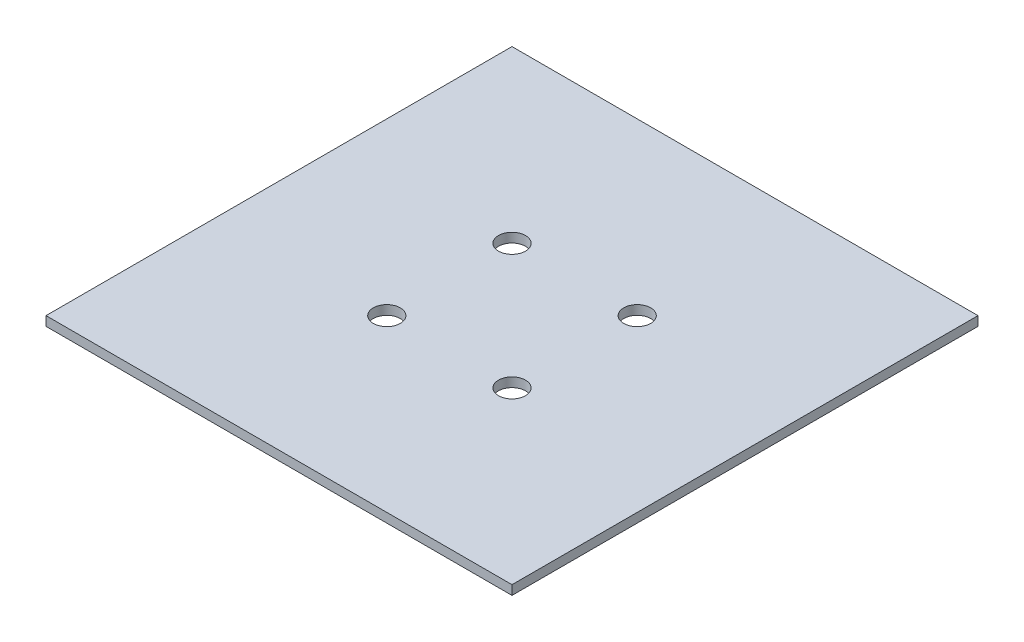
ISO-10303-21;
HEADER;
FILE_DESCRIPTION(('STEP AP214'),'2;1');
FILE_NAME('part.step','',(''),(''),'','','');
FILE_SCHEMA(('AUTOMOTIVE_DESIGN { 1 0 10303 214 1 1 1 1 }'));
ENDSEC;
DATA;
#1=APPLICATION_CONTEXT('core data for automotive mechanical design processes');
#2=APPLICATION_PROTOCOL_DEFINITION('international standard','automotive_design',2000,#1);
#3=PRODUCT_CONTEXT('',#1,'mechanical');
#4=PRODUCT('Part','Part','',(#3));
#5=PRODUCT_RELATED_PRODUCT_CATEGORY('part','',(#4));
#6=PRODUCT_DEFINITION_FORMATION('','',#4);
#7=PRODUCT_DEFINITION_CONTEXT('part definition',#1,'design');
#8=PRODUCT_DEFINITION('design','',#6,#7);
#9=PRODUCT_DEFINITION_SHAPE('','',#8);
#10=(LENGTH_UNIT() NAMED_UNIT(*) SI_UNIT(.MILLI.,.METRE.));
#11=(NAMED_UNIT(*) PLANE_ANGLE_UNIT() SI_UNIT($,.RADIAN.));
#12=(NAMED_UNIT(*) SI_UNIT($,.STERADIAN.) SOLID_ANGLE_UNIT());
#13=UNCERTAINTY_MEASURE_WITH_UNIT(LENGTH_MEASURE(1.E-05),#10,'distance_accuracy_value','');
#14=(GEOMETRIC_REPRESENTATION_CONTEXT(3) GLOBAL_UNCERTAINTY_ASSIGNED_CONTEXT((#13)) GLOBAL_UNIT_ASSIGNED_CONTEXT((#10,
#11,#12)) REPRESENTATION_CONTEXT('',''));
#15=CARTESIAN_POINT('',(0.,0.,0.));
#16=DIRECTION('',(0.,0.,1.));
#17=DIRECTION('',(1.,0.,0.));
#18=AXIS2_PLACEMENT_3D('',#15,#16,#17);
#19=CARTESIAN_POINT('',(25.,1.,-25.));
#20=DIRECTION('',(-1.,0.,0.));
#21=DIRECTION('',(0.,0.,1.));
#22=AXIS2_PLACEMENT_3D('',#19,#20,#21);
#23=PLANE('',#22);
#24=DIRECTION('',(0.,0.,-1.));
#25=VECTOR('',#24,1.);
#26=CARTESIAN_POINT('',(25.,0.,-25.));
#27=LINE('',#26,#25);
#28=CARTESIAN_POINT('',(25.,0.,25.));
#29=VERTEX_POINT('',#28);
#30=CARTESIAN_POINT('',(25.,0.,-25.));
#31=VERTEX_POINT('',#30);
#32=EDGE_CURVE('E97',#29,#31,#27,.T.);
#33=ORIENTED_EDGE('',*,*,#32,.T.);
#34=DIRECTION('',(0.,-1.,0.));
#35=VECTOR('',#34,1.);
#36=CARTESIAN_POINT('',(25.,1.,-25.));
#37=LINE('',#36,#35);
#38=CARTESIAN_POINT('',(25.,1.,-25.));
#39=VERTEX_POINT('',#38);
#40=EDGE_CURVE('E11',#39,#31,#37,.T.);
#41=ORIENTED_EDGE('',*,*,#40,.F.);
#42=DIRECTION('',(0.,0.,-1.));
#43=VECTOR('',#42,1.);
#44=CARTESIAN_POINT('',(25.,1.,-25.));
#45=LINE('',#44,#43);
#46=CARTESIAN_POINT('',(25.,1.,25.));
#47=VERTEX_POINT('',#46);
#48=EDGE_CURVE('E85',#47,#39,#45,.T.);
#49=ORIENTED_EDGE('',*,*,#48,.F.);
#50=DIRECTION('',(0.,-1.,0.));
#51=VECTOR('',#50,1.);
#52=CARTESIAN_POINT('',(25.,1.,25.));
#53=LINE('',#52,#51);
#54=EDGE_CURVE('E93',#47,#29,#53,.T.);
#55=ORIENTED_EDGE('',*,*,#54,.T.);
#56=EDGE_LOOP('',(#33,#41,#49,#55));
#57=FACE_BOUND('',#56,.T.);
#58=ADVANCED_FACE('F34',(#57),#23,.F.);
#59=CARTESIAN_POINT('',(-25.,1.,-25.));
#60=DIRECTION('',(0.,0.,1.));
#61=DIRECTION('',(1.,0.,0.));
#62=AXIS2_PLACEMENT_3D('',#59,#60,#61);
#63=PLANE('',#62);
#64=DIRECTION('',(-1.,0.,0.));
#65=VECTOR('',#64,1.);
#66=CARTESIAN_POINT('',(-25.,0.,-25.));
#67=LINE('',#66,#65);
#68=CARTESIAN_POINT('',(-25.,0.,-25.));
#69=VERTEX_POINT('',#68);
#70=EDGE_CURVE('E89',#31,#69,#67,.T.);
#71=ORIENTED_EDGE('',*,*,#70,.T.);
#72=DIRECTION('',(0.,-1.,0.));
#73=VECTOR('',#72,1.);
#74=CARTESIAN_POINT('',(-25.,1.,-25.));
#75=LINE('',#74,#73);
#76=CARTESIAN_POINT('',(-25.,1.,-25.));
#77=VERTEX_POINT('',#76);
#78=EDGE_CURVE('E42',#77,#69,#75,.T.);
#79=ORIENTED_EDGE('',*,*,#78,.F.);
#80=DIRECTION('',(-1.,0.,0.));
#81=VECTOR('',#80,1.);
#82=CARTESIAN_POINT('',(-25.,1.,-25.));
#83=LINE('',#82,#81);
#84=EDGE_CURVE('E80',#39,#77,#83,.T.);
#85=ORIENTED_EDGE('',*,*,#84,.F.);
#86=ORIENTED_EDGE('',*,*,#40,.T.);
#87=EDGE_LOOP('',(#71,#79,#85,#86));
#88=FACE_BOUND('',#87,.T.);
#89=ADVANCED_FACE('F88',(#88),#63,.F.);
#90=CARTESIAN_POINT('',(-25.,1.,-25.));
#91=DIRECTION('',(1.,0.,0.));
#92=DIRECTION('',(0.,0.,-1.));
#93=AXIS2_PLACEMENT_3D('',#90,#91,#92);
#94=PLANE('',#93);
#95=DIRECTION('',(0.,0.,1.));
#96=VECTOR('',#95,1.);
#97=CARTESIAN_POINT('',(-25.,0.,-25.));
#98=LINE('',#97,#96);
#99=CARTESIAN_POINT('',(-25.,0.,25.));
#100=VERTEX_POINT('',#99);
#101=EDGE_CURVE('E67',#69,#100,#98,.T.);
#102=ORIENTED_EDGE('',*,*,#101,.T.);
#103=DIRECTION('',(0.,-1.,0.));
#104=VECTOR('',#103,1.);
#105=CARTESIAN_POINT('',(-25.,1.,25.));
#106=LINE('',#105,#104);
#107=CARTESIAN_POINT('',(-25.,1.,25.));
#108=VERTEX_POINT('',#107);
#109=EDGE_CURVE('E90',#108,#100,#106,.T.);
#110=ORIENTED_EDGE('',*,*,#109,.F.);
#111=DIRECTION('',(0.,0.,1.));
#112=VECTOR('',#111,1.);
#113=CARTESIAN_POINT('',(-25.,1.,-25.));
#114=LINE('',#113,#112);
#115=EDGE_CURVE('E83',#77,#108,#114,.T.);
#116=ORIENTED_EDGE('',*,*,#115,.F.);
#117=ORIENTED_EDGE('',*,*,#78,.T.);
#118=EDGE_LOOP('',(#102,#110,#116,#117));
#119=FACE_BOUND('',#118,.T.);
#120=ADVANCED_FACE('F91',(#119),#94,.F.);
#121=CARTESIAN_POINT('',(-25.,1.,25.));
#122=DIRECTION('',(0.,0.,-1.));
#123=DIRECTION('',(-1.,0.,0.));
#124=AXIS2_PLACEMENT_3D('',#121,#122,#123);
#125=PLANE('',#124);
#126=DIRECTION('',(1.,0.,0.));
#127=VECTOR('',#126,1.);
#128=CARTESIAN_POINT('',(-25.,0.,25.));
#129=LINE('',#128,#127);
#130=EDGE_CURVE('E73',#100,#29,#129,.T.);
#131=ORIENTED_EDGE('',*,*,#130,.T.);
#132=ORIENTED_EDGE('',*,*,#54,.F.);
#133=DIRECTION('',(1.,0.,0.));
#134=VECTOR('',#133,1.);
#135=CARTESIAN_POINT('',(-25.,1.,25.));
#136=LINE('',#135,#134);
#137=EDGE_CURVE('E50',#108,#47,#136,.T.);
#138=ORIENTED_EDGE('',*,*,#137,.F.);
#139=ORIENTED_EDGE('',*,*,#109,.T.);
#140=EDGE_LOOP('',(#131,#132,#138,#139));
#141=FACE_BOUND('',#140,.T.);
#142=ADVANCED_FACE('F105',(#141),#125,.F.);
#143=CARTESIAN_POINT('',(0.,1.,0.));
#144=DIRECTION('',(0.,1.,0.));
#145=DIRECTION('',(0.,0.,1.));
#146=AXIS2_PLACEMENT_3D('',#143,#144,#145);
#147=PLANE('',#146);
#148=CARTESIAN_POINT('',(6.71751442127224,1.,-6.71751442127217));
#149=DIRECTION('',(0.,1.,0.));
#150=DIRECTION('',(0.,0.,1.));
#151=AXIS2_PLACEMENT_3D('',#148,#149,#150);
#152=CIRCLE('',#151,1.45);
#153=CARTESIAN_POINT('',(6.71751442127224,1.,-5.26751442127218));
#154=VERTEX_POINT('',#153);
#155=EDGE_CURVE('E117',#154,#154,#152,.F.);
#156=ORIENTED_EDGE('',*,*,#155,.T.);
#157=EDGE_LOOP('',(#156));
#158=FACE_BOUND('',#157,.T.);
#159=CARTESIAN_POINT('',(6.71751442127224,1.,6.71751442127215));
#160=DIRECTION('',(0.,1.,0.));
#161=DIRECTION('',(0.,0.,1.));
#162=AXIS2_PLACEMENT_3D('',#159,#160,#161);
#163=CIRCLE('',#162,1.45);
#164=CARTESIAN_POINT('',(6.71751442127224,1.,8.16751442127214));
#165=VERTEX_POINT('',#164);
#166=EDGE_CURVE('E124',#165,#165,#163,.F.);
#167=ORIENTED_EDGE('',*,*,#166,.T.);
#168=EDGE_LOOP('',(#167));
#169=FACE_BOUND('',#168,.T.);
#170=CARTESIAN_POINT('',(-6.71751442127224,1.,6.71751442127215));
#171=DIRECTION('',(0.,1.,0.));
#172=DIRECTION('',(0.,0.,1.));
#173=AXIS2_PLACEMENT_3D('',#170,#171,#172);
#174=CIRCLE('',#173,1.45);
#175=CARTESIAN_POINT('',(-6.71751442127224,1.,8.16751442127215));
#176=VERTEX_POINT('',#175);
#177=EDGE_CURVE('E116',#176,#176,#174,.F.);
#178=ORIENTED_EDGE('',*,*,#177,.T.);
#179=EDGE_LOOP('',(#178));
#180=FACE_BOUND('',#179,.T.);
#181=CARTESIAN_POINT('',(-6.71751442127223,1.,-6.71751442127218));
#182=DIRECTION('',(0.,1.,0.));
#183=DIRECTION('',(0.,0.,1.));
#184=AXIS2_PLACEMENT_3D('',#181,#182,#183);
#185=CIRCLE('',#184,1.45);
#186=CARTESIAN_POINT('',(-6.71751442127223,1.,-5.26751442127218));
#187=VERTEX_POINT('',#186);
#188=EDGE_CURVE('E100',#187,#187,#185,.F.);
#189=ORIENTED_EDGE('',*,*,#188,.T.);
#190=EDGE_LOOP('',(#189));
#191=FACE_BOUND('',#190,.T.);
#192=ORIENTED_EDGE('',*,*,#48,.T.);
#193=ORIENTED_EDGE('',*,*,#84,.T.);
#194=ORIENTED_EDGE('',*,*,#115,.T.);
#195=ORIENTED_EDGE('',*,*,#137,.T.);
#196=EDGE_LOOP('',(#192,#193,#194,#195));
#197=FACE_BOUND('',#196,.T.);
#198=ADVANCED_FACE('F81',(#158,#169,#180,#191,#197),#147,.T.);
#199=CARTESIAN_POINT('',(0.,0.,0.));
#200=DIRECTION('',(0.,1.,0.));
#201=DIRECTION('',(0.,0.,1.));
#202=AXIS2_PLACEMENT_3D('',#199,#200,#201);
#203=PLANE('',#202);
#204=CARTESIAN_POINT('',(6.71751442127224,0.,-6.71751442127217));
#205=DIRECTION('',(0.,-1.,0.));
#206=DIRECTION('',(0.,0.,-1.));
#207=AXIS2_PLACEMENT_3D('',#204,#205,#206);
#208=CIRCLE('',#207,1.45);
#209=CARTESIAN_POINT('',(6.71751442127224,0.,-8.16751442127217));
#210=VERTEX_POINT('',#209);
#211=EDGE_CURVE('E121',#210,#210,#208,.T.);
#212=ORIENTED_EDGE('',*,*,#211,.F.);
#213=EDGE_LOOP('',(#212));
#214=FACE_BOUND('',#213,.T.);
#215=CARTESIAN_POINT('',(6.71751442127224,0.,6.71751442127215));
#216=DIRECTION('',(0.,-1.,0.));
#217=DIRECTION('',(0.,0.,-1.));
#218=AXIS2_PLACEMENT_3D('',#215,#216,#217);
#219=CIRCLE('',#218,1.45);
#220=CARTESIAN_POINT('',(6.71751442127224,0.,5.26751442127215));
#221=VERTEX_POINT('',#220);
#222=EDGE_CURVE('E120',#221,#221,#219,.T.);
#223=ORIENTED_EDGE('',*,*,#222,.F.);
#224=EDGE_LOOP('',(#223));
#225=FACE_BOUND('',#224,.T.);
#226=CARTESIAN_POINT('',(-6.71751442127224,0.,6.71751442127215));
#227=DIRECTION('',(0.,-1.,0.));
#228=DIRECTION('',(0.,0.,-1.));
#229=AXIS2_PLACEMENT_3D('',#226,#227,#228);
#230=CIRCLE('',#229,1.45);
#231=CARTESIAN_POINT('',(-6.71751442127224,0.,5.26751442127215));
#232=VERTEX_POINT('',#231);
#233=EDGE_CURVE('E127',#232,#232,#230,.T.);
#234=ORIENTED_EDGE('',*,*,#233,.F.);
#235=EDGE_LOOP('',(#234));
#236=FACE_BOUND('',#235,.T.);
#237=CARTESIAN_POINT('',(-6.71751442127223,0.,-6.71751442127218));
#238=DIRECTION('',(0.,-1.,0.));
#239=DIRECTION('',(0.,0.,-1.));
#240=AXIS2_PLACEMENT_3D('',#237,#238,#239);
#241=CIRCLE('',#240,1.45);
#242=CARTESIAN_POINT('',(-6.71751442127223,0.,-8.16751442127218));
#243=VERTEX_POINT('',#242);
#244=EDGE_CURVE('E113',#243,#243,#241,.T.);
#245=ORIENTED_EDGE('',*,*,#244,.F.);
#246=EDGE_LOOP('',(#245));
#247=FACE_BOUND('',#246,.T.);
#248=ORIENTED_EDGE('',*,*,#32,.F.);
#249=ORIENTED_EDGE('',*,*,#130,.F.);
#250=ORIENTED_EDGE('',*,*,#101,.F.);
#251=ORIENTED_EDGE('',*,*,#70,.F.);
#252=EDGE_LOOP('',(#248,#249,#250,#251));
#253=FACE_BOUND('',#252,.T.);
#254=ADVANCED_FACE('F108',(#214,#225,#236,#247,#253),#203,.F.);
#255=CARTESIAN_POINT('',(-6.71751442127223,5.10121933088197,-6.71751442127218));
#256=DIRECTION('',(0.,-1.,0.));
#257=DIRECTION('',(0.,0.,-1.));
#258=AXIS2_PLACEMENT_3D('',#255,#256,#257);
#259=CYLINDRICAL_SURFACE('',#258,1.45);
#260=ORIENTED_EDGE('',*,*,#244,.T.);
#261=EDGE_LOOP('',(#260));
#262=FACE_BOUND('',#261,.T.);
#263=ORIENTED_EDGE('',*,*,#188,.F.);
#264=EDGE_LOOP('',(#263));
#265=FACE_BOUND('',#264,.T.);
#266=ADVANCED_FACE('F140',(#262,#265),#259,.F.);
#267=CARTESIAN_POINT('',(-6.71751442127224,5.10121933088197,6.71751442127215));
#268=DIRECTION('',(0.,-1.,0.));
#269=DIRECTION('',(0.,0.,-1.));
#270=AXIS2_PLACEMENT_3D('',#267,#268,#269);
#271=CYLINDRICAL_SURFACE('',#270,1.45);
#272=ORIENTED_EDGE('',*,*,#233,.T.);
#273=EDGE_LOOP('',(#272));
#274=FACE_BOUND('',#273,.T.);
#275=ORIENTED_EDGE('',*,*,#177,.F.);
#276=EDGE_LOOP('',(#275));
#277=FACE_BOUND('',#276,.T.);
#278=ADVANCED_FACE('F135',(#274,#277),#271,.F.);
#279=CARTESIAN_POINT('',(6.71751442127224,5.10121933088197,6.71751442127215));
#280=DIRECTION('',(0.,-1.,0.));
#281=DIRECTION('',(0.,0.,-1.));
#282=AXIS2_PLACEMENT_3D('',#279,#280,#281);
#283=CYLINDRICAL_SURFACE('',#282,1.45);
#284=ORIENTED_EDGE('',*,*,#222,.T.);
#285=EDGE_LOOP('',(#284));
#286=FACE_BOUND('',#285,.T.);
#287=ORIENTED_EDGE('',*,*,#166,.F.);
#288=EDGE_LOOP('',(#287));
#289=FACE_BOUND('',#288,.T.);
#290=ADVANCED_FACE('F197',(#286,#289),#283,.F.);
#291=CARTESIAN_POINT('',(6.71751442127224,5.10121933088197,-6.71751442127217));
#292=DIRECTION('',(0.,-1.,0.));
#293=DIRECTION('',(0.,0.,-1.));
#294=AXIS2_PLACEMENT_3D('',#291,#292,#293);
#295=CYLINDRICAL_SURFACE('',#294,1.45);
#296=ORIENTED_EDGE('',*,*,#211,.T.);
#297=EDGE_LOOP('',(#296));
#298=FACE_BOUND('',#297,.T.);
#299=ORIENTED_EDGE('',*,*,#155,.F.);
#300=EDGE_LOOP('',(#299));
#301=FACE_BOUND('',#300,.T.);
#302=ADVANCED_FACE('F206',(#298,#301),#295,.F.);
#303=CLOSED_SHELL('',(#58,#89,#120,#142,#198,#254,#266,#278,#290,#302));
#304=MANIFOLD_SOLID_BREP('B2',#303);
#305=ADVANCED_BREP_SHAPE_REPRESENTATION('',(#18,#304),#14);
#306=SHAPE_DEFINITION_REPRESENTATION(#9,#305);
ENDSEC;
END-ISO-10303-21;
